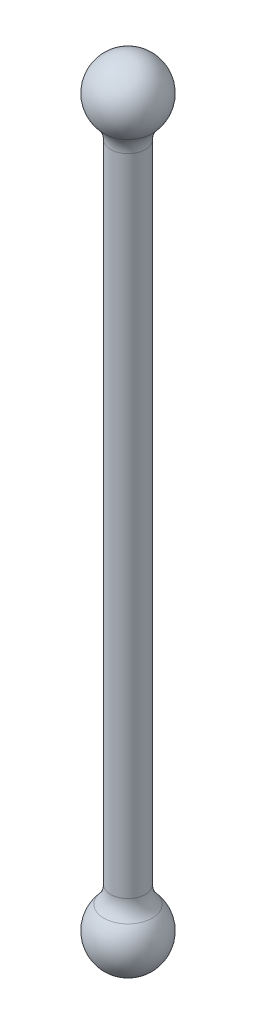
ISO-10303-21;
HEADER;
FILE_DESCRIPTION(('STEP AP214'),'2;1');
FILE_NAME('part.step','',(''),(''),'','','');
FILE_SCHEMA(('AUTOMOTIVE_DESIGN { 1 0 10303 214 1 1 1 1 }'));
ENDSEC;
DATA;
#1=APPLICATION_CONTEXT('core data for automotive mechanical design processes');
#2=APPLICATION_PROTOCOL_DEFINITION('international standard','automotive_design',2000,#1);
#3=PRODUCT_CONTEXT('',#1,'mechanical');
#4=PRODUCT('Part','Part','',(#3));
#5=PRODUCT_RELATED_PRODUCT_CATEGORY('part','',(#4));
#6=PRODUCT_DEFINITION_FORMATION('','',#4);
#7=PRODUCT_DEFINITION_CONTEXT('part definition',#1,'design');
#8=PRODUCT_DEFINITION('design','',#6,#7);
#9=PRODUCT_DEFINITION_SHAPE('','',#8);
#10=(LENGTH_UNIT() NAMED_UNIT(*) SI_UNIT(.MILLI.,.METRE.));
#11=(NAMED_UNIT(*) PLANE_ANGLE_UNIT() SI_UNIT($,.RADIAN.));
#12=(NAMED_UNIT(*) SI_UNIT($,.STERADIAN.) SOLID_ANGLE_UNIT());
#13=UNCERTAINTY_MEASURE_WITH_UNIT(LENGTH_MEASURE(1.E-05),#10,'distance_accuracy_value','');
#14=(GEOMETRIC_REPRESENTATION_CONTEXT(3) GLOBAL_UNCERTAINTY_ASSIGNED_CONTEXT((#13)) GLOBAL_UNIT_ASSIGNED_CONTEXT((#10,
#11,#12)) REPRESENTATION_CONTEXT('',''));
#15=CARTESIAN_POINT('',(0.,0.,0.));
#16=DIRECTION('',(0.,0.,1.));
#17=DIRECTION('',(1.,0.,0.));
#18=AXIS2_PLACEMENT_3D('',#15,#16,#17);
#19=CARTESIAN_POINT('',(0.,-8.11249036979397,0.));
#20=DIRECTION('',(0.,1.,0.));
#21=DIRECTION('',(-1.,0.,0.));
#22=AXIS2_PLACEMENT_3D('',#19,#20,#21);
#23=TOROIDAL_SURFACE('',#22,8.50000000000001,5.);
#24=CARTESIAN_POINT('',(0.,-4.66036680817951,0.));
#25=DIRECTION('',(0.,1.,0.));
#26=DIRECTION('',(-1.,0.,0.));
#27=AXIS2_PLACEMENT_3D('',#24,#25,#26);
#28=CIRCLE('',#27,4.88297872340426);
#29=CARTESIAN_POINT('',(-4.88297872340426,-4.66036680817951,0.));
#30=VERTEX_POINT('',#29);
#31=EDGE_CURVE('E48',#30,#30,#28,.T.);
#32=ORIENTED_EDGE('',*,*,#31,.F.);
#33=EDGE_LOOP('',(#32));
#34=FACE_BOUND('',#33,.T.);
#35=CARTESIAN_POINT('',(0.,-8.11249036979397,0.));
#36=DIRECTION('',(0.,1.,0.));
#37=DIRECTION('',(-1.,0.,0.));
#38=AXIS2_PLACEMENT_3D('',#35,#36,#37);
#39=CIRCLE('',#38,3.50000000000001);
#40=CARTESIAN_POINT('',(-3.50000000000001,-8.11249036979397,0.));
#41=VERTEX_POINT('',#40);
#42=EDGE_CURVE('E10',#41,#41,#39,.T.);
#43=ORIENTED_EDGE('',*,*,#42,.T.);
#44=EDGE_LOOP('',(#43));
#45=FACE_BOUND('',#44,.T.);
#46=ADVANCED_FACE('F41',(#34,#45),#23,.F.);
#47=CARTESIAN_POINT('',(0.,6.75,0.));
#48=DIRECTION('',(0.,1.,0.));
#49=DIRECTION('',(-1.,0.,0.));
#50=AXIS2_PLACEMENT_3D('',#47,#48,#49);
#51=CYLINDRICAL_SURFACE('',#50,3.5);
#52=ORIENTED_EDGE('',*,*,#42,.F.);
#53=EDGE_LOOP('',(#52));
#54=FACE_BOUND('',#53,.T.);
#55=CARTESIAN_POINT('',(0.,-138.387509630206,0.));
#56=DIRECTION('',(0.,1.,0.));
#57=DIRECTION('',(-1.,0.,0.));
#58=AXIS2_PLACEMENT_3D('',#55,#56,#57);
#59=CIRCLE('',#58,3.50000000000001);
#60=CARTESIAN_POINT('',(-3.49999999999999,-138.387509630206,0.));
#61=VERTEX_POINT('',#60);
#62=EDGE_CURVE('E53',#61,#61,#59,.T.);
#63=ORIENTED_EDGE('',*,*,#62,.T.);
#64=EDGE_LOOP('',(#63));
#65=FACE_BOUND('',#64,.T.);
#66=ADVANCED_FACE('F77',(#54,#65),#51,.T.);
#67=CARTESIAN_POINT('',(0.,0.,0.));
#68=DIRECTION('',(0.,1.,0.));
#69=DIRECTION('',(1.,0.,0.));
#70=AXIS2_PLACEMENT_3D('',#67,#68,#69);
#71=SPHERICAL_SURFACE('',#70,6.75);
#72=ORIENTED_EDGE('',*,*,#31,.T.);
#73=EDGE_LOOP('',(#72));
#74=FACE_BOUND('',#73,.T.);
#75=ADVANCED_FACE('F74',(#74),#71,.T.);
#76=CARTESIAN_POINT('',(0.,-138.387509630206,0.));
#77=DIRECTION('',(0.,-1.,0.));
#78=DIRECTION('',(-1.,0.,0.));
#79=AXIS2_PLACEMENT_3D('',#76,#77,#78);
#80=TOROIDAL_SURFACE('',#79,8.50000000000001,5.);
#81=CARTESIAN_POINT('',(0.,-141.83963319182,0.));
#82=DIRECTION('',(0.,1.,0.));
#83=DIRECTION('',(-1.,0.,0.));
#84=AXIS2_PLACEMENT_3D('',#81,#82,#83);
#85=CIRCLE('',#84,4.88297872340426);
#86=CARTESIAN_POINT('',(-4.88297872340424,-141.83963319182,0.));
#87=VERTEX_POINT('',#86);
#88=EDGE_CURVE('E58',#87,#87,#85,.T.);
#89=ORIENTED_EDGE('',*,*,#88,.T.);
#90=EDGE_LOOP('',(#89));
#91=FACE_BOUND('',#90,.T.);
#92=ORIENTED_EDGE('',*,*,#62,.F.);
#93=EDGE_LOOP('',(#92));
#94=FACE_BOUND('',#93,.T.);
#95=ADVANCED_FACE('F65',(#91,#94),#80,.F.);
#96=CARTESIAN_POINT('',(0.,-146.5,0.));
#97=DIRECTION('',(0.,-1.,0.));
#98=DIRECTION('',(1.,0.,0.));
#99=AXIS2_PLACEMENT_3D('',#96,#97,#98);
#100=SPHERICAL_SURFACE('',#99,6.75);
#101=ORIENTED_EDGE('',*,*,#88,.F.);
#102=EDGE_LOOP('',(#101));
#103=FACE_BOUND('',#102,.T.);
#104=ADVANCED_FACE('F68',(#103),#100,.T.);
#105=CLOSED_SHELL('',(#46,#66,#75,#95,#104));
#106=MANIFOLD_SOLID_BREP('B2',#105);
#107=ADVANCED_BREP_SHAPE_REPRESENTATION('',(#18,#106),#14);
#108=SHAPE_DEFINITION_REPRESENTATION(#9,#107);
ENDSEC;
END-ISO-10303-21;
